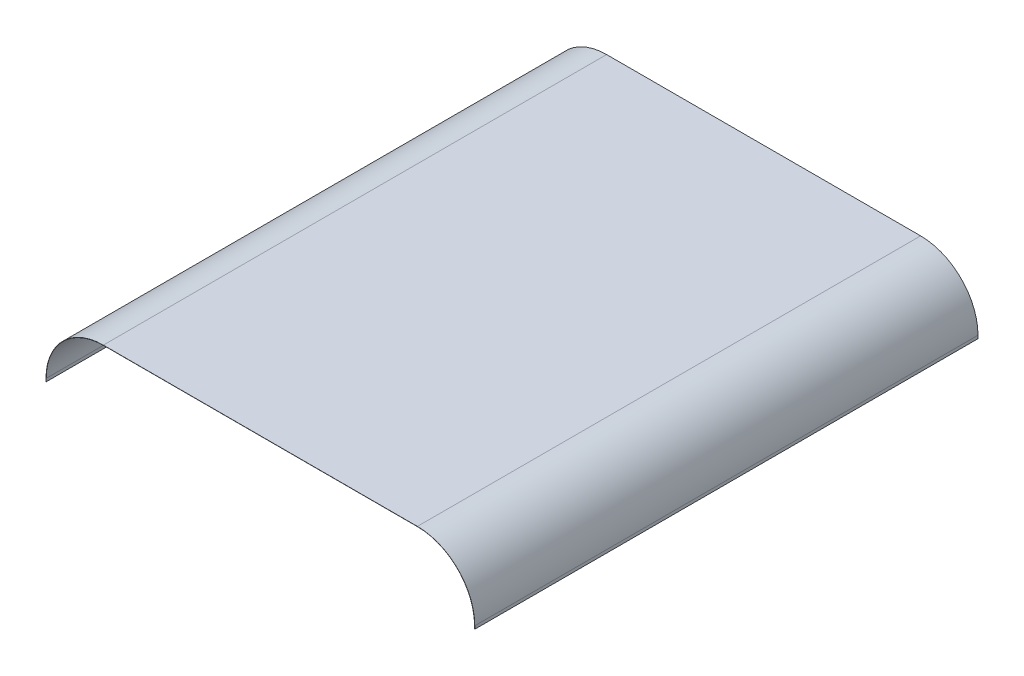
ISO-10303-21;
HEADER;
FILE_DESCRIPTION(('STEP AP214'),'2;1');
FILE_NAME('part.step','',(''),(''),'','','');
FILE_SCHEMA(('AUTOMOTIVE_DESIGN { 1 0 10303 214 1 1 1 1 }'));
ENDSEC;
DATA;
#1=APPLICATION_CONTEXT('core data for automotive mechanical design processes');
#2=APPLICATION_PROTOCOL_DEFINITION('international standard','automotive_design',2000,#1);
#3=PRODUCT_CONTEXT('',#1,'mechanical');
#4=PRODUCT('Part','Part','',(#3));
#5=PRODUCT_RELATED_PRODUCT_CATEGORY('part','',(#4));
#6=PRODUCT_DEFINITION_FORMATION('','',#4);
#7=PRODUCT_DEFINITION_CONTEXT('part definition',#1,'design');
#8=PRODUCT_DEFINITION('design','',#6,#7);
#9=PRODUCT_DEFINITION_SHAPE('','',#8);
#10=(LENGTH_UNIT() NAMED_UNIT(*) SI_UNIT(.MILLI.,.METRE.));
#11=(NAMED_UNIT(*) PLANE_ANGLE_UNIT() SI_UNIT($,.RADIAN.));
#12=(NAMED_UNIT(*) SI_UNIT($,.STERADIAN.) SOLID_ANGLE_UNIT());
#13=UNCERTAINTY_MEASURE_WITH_UNIT(LENGTH_MEASURE(1.E-05),#10,'distance_accuracy_value','');
#14=(GEOMETRIC_REPRESENTATION_CONTEXT(3) GLOBAL_UNCERTAINTY_ASSIGNED_CONTEXT((#13)) GLOBAL_UNIT_ASSIGNED_CONTEXT((#10,
#11,#12)) REPRESENTATION_CONTEXT('',''));
#15=CARTESIAN_POINT('',(0.,0.,0.));
#16=DIRECTION('',(0.,0.,1.));
#17=DIRECTION('',(1.,0.,0.));
#18=AXIS2_PLACEMENT_3D('',#15,#16,#17);
#19=CARTESIAN_POINT('',(2130.,0.,0.));
#20=DIRECTION('',(0.,0.,-1.));
#21=DIRECTION('',(0.,-1.,0.));
#22=AXIS2_PLACEMENT_3D('',#19,#20,#21);
#23=PLANE('',#22);
#24=DIRECTION('',(0.,1.,0.));
#25=VECTOR('',#24,1.);
#26=CARTESIAN_POINT('',(2129.,0.,0.));
#27=LINE('',#26,#25);
#28=CARTESIAN_POINT('',(2129.,0.,0.));
#29=VERTEX_POINT('',#28);
#30=CARTESIAN_POINT('',(2129.,-15.,0.));
#31=VERTEX_POINT('',#30);
#32=EDGE_CURVE('E196',#29,#31,#27,.F.);
#33=ORIENTED_EDGE('',*,*,#32,.F.);
#34=CARTESIAN_POINT('',(1845.,0.,0.));
#35=DIRECTION('',(0.,0.,1.));
#36=DIRECTION('',(1.,0.,0.));
#37=AXIS2_PLACEMENT_3D('',#34,#35,#36);
#38=CIRCLE('',#37,284.);
#39=CARTESIAN_POINT('',(1845.,284.,0.));
#40=VERTEX_POINT('',#39);
#41=EDGE_CURVE('E192',#40,#29,#38,.F.);
#42=ORIENTED_EDGE('',*,*,#41,.F.);
#43=DIRECTION('',(1.,0.,0.));
#44=VECTOR('',#43,1.);
#45=CARTESIAN_POINT('',(285.,284.,0.));
#46=LINE('',#45,#44);
#47=CARTESIAN_POINT('',(285.,284.,0.));
#48=VERTEX_POINT('',#47);
#49=EDGE_CURVE('E188',#48,#40,#46,.T.);
#50=ORIENTED_EDGE('',*,*,#49,.F.);
#51=CARTESIAN_POINT('',(285.,0.,0.));
#52=DIRECTION('',(0.,0.,1.));
#53=DIRECTION('',(1.,0.,0.));
#54=AXIS2_PLACEMENT_3D('',#51,#52,#53);
#55=CIRCLE('',#54,284.);
#56=CARTESIAN_POINT('',(1.,0.,0.));
#57=VERTEX_POINT('',#56);
#58=EDGE_CURVE('E185',#57,#48,#55,.F.);
#59=ORIENTED_EDGE('',*,*,#58,.F.);
#60=DIRECTION('',(0.,1.,0.));
#61=VECTOR('',#60,1.);
#62=CARTESIAN_POINT('',(1.,0.,0.));
#63=LINE('',#62,#61);
#64=CARTESIAN_POINT('',(1.,-15.,0.));
#65=VERTEX_POINT('',#64);
#66=EDGE_CURVE('E181',#65,#57,#63,.T.);
#67=ORIENTED_EDGE('',*,*,#66,.F.);
#68=DIRECTION('',(1.,0.,0.));
#69=VECTOR('',#68,1.);
#70=CARTESIAN_POINT('',(0.,-15.,0.));
#71=LINE('',#70,#69);
#72=CARTESIAN_POINT('',(0.,-15.,0.));
#73=VERTEX_POINT('',#72);
#74=EDGE_CURVE('E11',#73,#65,#71,.T.);
#75=ORIENTED_EDGE('',*,*,#74,.F.);
#76=DIRECTION('',(0.,1.,0.));
#77=VECTOR('',#76,1.);
#78=CARTESIAN_POINT('',(0.,0.,0.));
#79=LINE('',#78,#77);
#80=CARTESIAN_POINT('',(0.,0.,0.));
#81=VERTEX_POINT('',#80);
#82=EDGE_CURVE('E154',#73,#81,#79,.T.);
#83=ORIENTED_EDGE('',*,*,#82,.T.);
#84=CARTESIAN_POINT('',(285.,0.,0.));
#85=DIRECTION('',(0.,0.,-1.));
#86=DIRECTION('',(-1.,0.,0.));
#87=AXIS2_PLACEMENT_3D('',#84,#85,#86);
#88=CIRCLE('',#87,285.);
#89=CARTESIAN_POINT('',(285.,285.,0.));
#90=VERTEX_POINT('',#89);
#91=EDGE_CURVE('E156',#81,#90,#88,.T.);
#92=ORIENTED_EDGE('',*,*,#91,.T.);
#93=DIRECTION('',(1.,0.,0.));
#94=VECTOR('',#93,1.);
#95=CARTESIAN_POINT('',(285.,285.,0.));
#96=LINE('',#95,#94);
#97=CARTESIAN_POINT('',(1845.,285.,0.));
#98=VERTEX_POINT('',#97);
#99=EDGE_CURVE('E149',#90,#98,#96,.T.);
#100=ORIENTED_EDGE('',*,*,#99,.T.);
#101=CARTESIAN_POINT('',(1845.,0.,0.));
#102=DIRECTION('',(0.,0.,-1.));
#103=DIRECTION('',(1.,0.,0.));
#104=AXIS2_PLACEMENT_3D('',#101,#102,#103);
#105=CIRCLE('',#104,285.);
#106=CARTESIAN_POINT('',(2130.,0.,0.));
#107=VERTEX_POINT('',#106);
#108=EDGE_CURVE('E146',#98,#107,#105,.T.);
#109=ORIENTED_EDGE('',*,*,#108,.T.);
#110=DIRECTION('',(0.,-1.,0.));
#111=VECTOR('',#110,1.);
#112=CARTESIAN_POINT('',(2130.,0.,0.));
#113=LINE('',#112,#111);
#114=CARTESIAN_POINT('',(2130.,-15.,0.));
#115=VERTEX_POINT('',#114);
#116=EDGE_CURVE('E136',#107,#115,#113,.T.);
#117=ORIENTED_EDGE('',*,*,#116,.T.);
#118=DIRECTION('',(-1.,0.,0.));
#119=VECTOR('',#118,1.);
#120=CARTESIAN_POINT('',(2130.,-15.,0.));
#121=LINE('',#120,#119);
#122=EDGE_CURVE('E46',#115,#31,#121,.T.);
#123=ORIENTED_EDGE('',*,*,#122,.T.);
#124=EDGE_LOOP('',(#33,#42,#50,#59,#67,#75,#83,#92,#100,#109,#117,#123));
#125=FACE_BOUND('',#124,.T.);
#126=ADVANCED_FACE('F36',(#125),#23,.T.);
#127=CARTESIAN_POINT('',(2130.,-15.,0.));
#128=DIRECTION('',(0.,-1.,0.));
#129=DIRECTION('',(0.,0.,1.));
#130=AXIS2_PLACEMENT_3D('',#127,#128,#129);
#131=PLANE('',#130);
#132=ORIENTED_EDGE('',*,*,#122,.F.);
#133=DIRECTION('',(0.,0.,1.));
#134=VECTOR('',#133,1.);
#135=CARTESIAN_POINT('',(2130.,-15.,0.));
#136=LINE('',#135,#134);
#137=CARTESIAN_POINT('',(2130.,-15.,2500.));
#138=VERTEX_POINT('',#137);
#139=EDGE_CURVE('E132',#115,#138,#136,.T.);
#140=ORIENTED_EDGE('',*,*,#139,.T.);
#141=DIRECTION('',(-1.,0.,0.));
#142=VECTOR('',#141,1.);
#143=CARTESIAN_POINT('',(2130.,-15.,2500.));
#144=LINE('',#143,#142);
#145=CARTESIAN_POINT('',(2129.,-15.,2500.));
#146=VERTEX_POINT('',#145);
#147=EDGE_CURVE('E117',#138,#146,#144,.T.);
#148=ORIENTED_EDGE('',*,*,#147,.T.);
#149=DIRECTION('',(0.,0.,1.));
#150=VECTOR('',#149,1.);
#151=CARTESIAN_POINT('',(2129.,-15.,0.));
#152=LINE('',#151,#150);
#153=EDGE_CURVE('E198',#31,#146,#152,.T.);
#154=ORIENTED_EDGE('',*,*,#153,.F.);
#155=EDGE_LOOP('',(#132,#140,#148,#154));
#156=FACE_BOUND('',#155,.T.);
#157=ADVANCED_FACE('F134',(#156),#131,.T.);
#158=CARTESIAN_POINT('',(0.,0.,2500.));
#159=DIRECTION('',(0.,0.,-1.));
#160=DIRECTION('',(0.,1.,0.));
#161=AXIS2_PLACEMENT_3D('',#158,#159,#160);
#162=PLANE('',#161);
#163=DIRECTION('',(0.,1.,0.));
#164=VECTOR('',#163,1.);
#165=CARTESIAN_POINT('',(1.,0.,2500.));
#166=LINE('',#165,#164);
#167=CARTESIAN_POINT('',(1.,-15.,2500.));
#168=VERTEX_POINT('',#167);
#169=CARTESIAN_POINT('',(1.,0.,2500.));
#170=VERTEX_POINT('',#169);
#171=EDGE_CURVE('E182',#168,#170,#166,.T.);
#172=ORIENTED_EDGE('',*,*,#171,.T.);
#173=CARTESIAN_POINT('',(285.,0.,2500.));
#174=DIRECTION('',(0.,0.,1.));
#175=DIRECTION('',(1.,0.,0.));
#176=AXIS2_PLACEMENT_3D('',#173,#174,#175);
#177=CIRCLE('',#176,284.);
#178=CARTESIAN_POINT('',(285.,284.,2500.));
#179=VERTEX_POINT('',#178);
#180=EDGE_CURVE('E190',#170,#179,#177,.F.);
#181=ORIENTED_EDGE('',*,*,#180,.T.);
#182=DIRECTION('',(1.,0.,0.));
#183=VECTOR('',#182,1.);
#184=CARTESIAN_POINT('',(285.,284.,2500.));
#185=LINE('',#184,#183);
#186=CARTESIAN_POINT('',(1845.,284.,2500.));
#187=VERTEX_POINT('',#186);
#188=EDGE_CURVE('E194',#179,#187,#185,.T.);
#189=ORIENTED_EDGE('',*,*,#188,.T.);
#190=CARTESIAN_POINT('',(1845.,0.,2500.));
#191=DIRECTION('',(0.,0.,1.));
#192=DIRECTION('',(1.,0.,0.));
#193=AXIS2_PLACEMENT_3D('',#190,#191,#192);
#194=CIRCLE('',#193,284.);
#195=CARTESIAN_POINT('',(2129.,0.,2500.));
#196=VERTEX_POINT('',#195);
#197=EDGE_CURVE('E201',#187,#196,#194,.F.);
#198=ORIENTED_EDGE('',*,*,#197,.T.);
#199=DIRECTION('',(0.,1.,0.));
#200=VECTOR('',#199,1.);
#201=CARTESIAN_POINT('',(2129.,0.,2500.));
#202=LINE('',#201,#200);
#203=EDGE_CURVE('E124',#196,#146,#202,.F.);
#204=ORIENTED_EDGE('',*,*,#203,.T.);
#205=ORIENTED_EDGE('',*,*,#147,.F.);
#206=DIRECTION('',(0.,-1.,0.));
#207=VECTOR('',#206,1.);
#208=CARTESIAN_POINT('',(2130.,0.,2500.));
#209=LINE('',#208,#207);
#210=CARTESIAN_POINT('',(2130.,0.,2500.));
#211=VERTEX_POINT('',#210);
#212=EDGE_CURVE('E121',#211,#138,#209,.T.);
#213=ORIENTED_EDGE('',*,*,#212,.F.);
#214=CARTESIAN_POINT('',(1845.,0.,2500.));
#215=DIRECTION('',(0.,0.,-1.));
#216=DIRECTION('',(1.,0.,0.));
#217=AXIS2_PLACEMENT_3D('',#214,#215,#216);
#218=CIRCLE('',#217,285.);
#219=CARTESIAN_POINT('',(1845.,285.,2500.));
#220=VERTEX_POINT('',#219);
#221=EDGE_CURVE('E135',#220,#211,#218,.T.);
#222=ORIENTED_EDGE('',*,*,#221,.F.);
#223=DIRECTION('',(1.,0.,0.));
#224=VECTOR('',#223,1.);
#225=CARTESIAN_POINT('',(285.,285.,2500.));
#226=LINE('',#225,#224);
#227=CARTESIAN_POINT('',(285.,285.,2500.));
#228=VERTEX_POINT('',#227);
#229=EDGE_CURVE('E150',#228,#220,#226,.T.);
#230=ORIENTED_EDGE('',*,*,#229,.F.);
#231=CARTESIAN_POINT('',(285.,0.,2500.));
#232=DIRECTION('',(0.,0.,-1.));
#233=DIRECTION('',(-1.,0.,0.));
#234=AXIS2_PLACEMENT_3D('',#231,#232,#233);
#235=CIRCLE('',#234,285.);
#236=CARTESIAN_POINT('',(0.,0.,2500.));
#237=VERTEX_POINT('',#236);
#238=EDGE_CURVE('E157',#237,#228,#235,.T.);
#239=ORIENTED_EDGE('',*,*,#238,.F.);
#240=DIRECTION('',(0.,1.,0.));
#241=VECTOR('',#240,1.);
#242=CARTESIAN_POINT('',(0.,0.,2500.));
#243=LINE('',#242,#241);
#244=CARTESIAN_POINT('',(0.,-15.,2500.));
#245=VERTEX_POINT('',#244);
#246=EDGE_CURVE('E143',#245,#237,#243,.T.);
#247=ORIENTED_EDGE('',*,*,#246,.F.);
#248=DIRECTION('',(1.,0.,0.));
#249=VECTOR('',#248,1.);
#250=CARTESIAN_POINT('',(0.,-15.,2500.));
#251=LINE('',#250,#249);
#252=EDGE_CURVE('E40',#245,#168,#251,.T.);
#253=ORIENTED_EDGE('',*,*,#252,.T.);
#254=EDGE_LOOP('',(#172,#181,#189,#198,#204,#205,#213,#222,#230,#239,#247,#253));
#255=FACE_BOUND('',#254,.T.);
#256=ADVANCED_FACE('F119',(#255),#162,.F.);
#257=CARTESIAN_POINT('',(0.,-15.,0.));
#258=DIRECTION('',(0.,1.,0.));
#259=DIRECTION('',(0.,0.,1.));
#260=AXIS2_PLACEMENT_3D('',#257,#258,#259);
#261=PLANE('',#260);
#262=DIRECTION('',(0.,0.,1.));
#263=VECTOR('',#262,1.);
#264=CARTESIAN_POINT('',(0.,-15.,0.));
#265=LINE('',#264,#263);
#266=EDGE_CURVE('E151',#73,#245,#265,.T.);
#267=ORIENTED_EDGE('',*,*,#266,.F.);
#268=ORIENTED_EDGE('',*,*,#74,.T.);
#269=DIRECTION('',(0.,0.,1.));
#270=VECTOR('',#269,1.);
#271=CARTESIAN_POINT('',(1.,-15.,0.));
#272=LINE('',#271,#270);
#273=EDGE_CURVE('E178',#65,#168,#272,.T.);
#274=ORIENTED_EDGE('',*,*,#273,.T.);
#275=ORIENTED_EDGE('',*,*,#252,.F.);
#276=EDGE_LOOP('',(#267,#268,#274,#275));
#277=FACE_BOUND('',#276,.T.);
#278=ADVANCED_FACE('F38',(#277),#261,.F.);
#279=CARTESIAN_POINT('',(1.,0.,0.));
#280=DIRECTION('',(1.,0.,0.));
#281=DIRECTION('',(0.,1.,0.));
#282=AXIS2_PLACEMENT_3D('',#279,#280,#281);
#283=PLANE('',#282);
#284=ORIENTED_EDGE('',*,*,#171,.F.);
#285=ORIENTED_EDGE('',*,*,#273,.F.);
#286=ORIENTED_EDGE('',*,*,#66,.T.);
#287=DIRECTION('',(0.,0.,1.));
#288=VECTOR('',#287,1.);
#289=CARTESIAN_POINT('',(1.,0.,0.));
#290=LINE('',#289,#288);
#291=EDGE_CURVE('E187',#57,#170,#290,.T.);
#292=ORIENTED_EDGE('',*,*,#291,.T.);
#293=EDGE_LOOP('',(#284,#285,#286,#292));
#294=FACE_BOUND('',#293,.T.);
#295=ADVANCED_FACE('F219',(#294),#283,.T.);
#296=CARTESIAN_POINT('',(285.,0.,0.));
#297=DIRECTION('',(0.,0.,1.));
#298=DIRECTION('',(1.,0.,0.));
#299=AXIS2_PLACEMENT_3D('',#296,#297,#298);
#300=CYLINDRICAL_SURFACE('',#299,284.);
#301=ORIENTED_EDGE('',*,*,#180,.F.);
#302=ORIENTED_EDGE('',*,*,#291,.F.);
#303=ORIENTED_EDGE('',*,*,#58,.T.);
#304=DIRECTION('',(0.,0.,1.));
#305=VECTOR('',#304,1.);
#306=CARTESIAN_POINT('',(285.,284.,0.));
#307=LINE('',#306,#305);
#308=EDGE_CURVE('E191',#48,#179,#307,.T.);
#309=ORIENTED_EDGE('',*,*,#308,.T.);
#310=EDGE_LOOP('',(#301,#302,#303,#309));
#311=FACE_BOUND('',#310,.T.);
#312=ADVANCED_FACE('F225',(#311),#300,.F.);
#313=CARTESIAN_POINT('',(285.,284.,0.));
#314=DIRECTION('',(0.,-1.,0.));
#315=DIRECTION('',(0.,0.,-1.));
#316=AXIS2_PLACEMENT_3D('',#313,#314,#315);
#317=PLANE('',#316);
#318=ORIENTED_EDGE('',*,*,#188,.F.);
#319=ORIENTED_EDGE('',*,*,#308,.F.);
#320=ORIENTED_EDGE('',*,*,#49,.T.);
#321=DIRECTION('',(0.,0.,-1.));
#322=VECTOR('',#321,1.);
#323=CARTESIAN_POINT('',(1845.,284.,0.));
#324=LINE('',#323,#322);
#325=EDGE_CURVE('E195',#40,#187,#324,.F.);
#326=ORIENTED_EDGE('',*,*,#325,.T.);
#327=EDGE_LOOP('',(#318,#319,#320,#326));
#328=FACE_BOUND('',#327,.T.);
#329=ADVANCED_FACE('F239',(#328),#317,.T.);
#330=CARTESIAN_POINT('',(1845.,0.,0.));
#331=DIRECTION('',(0.,0.,1.));
#332=DIRECTION('',(1.,0.,0.));
#333=AXIS2_PLACEMENT_3D('',#330,#331,#332);
#334=CYLINDRICAL_SURFACE('',#333,284.);
#335=ORIENTED_EDGE('',*,*,#197,.F.);
#336=ORIENTED_EDGE('',*,*,#325,.F.);
#337=ORIENTED_EDGE('',*,*,#41,.T.);
#338=DIRECTION('',(0.,0.,1.));
#339=VECTOR('',#338,1.);
#340=CARTESIAN_POINT('',(2129.,0.,0.));
#341=LINE('',#340,#339);
#342=EDGE_CURVE('E199',#29,#196,#341,.T.);
#343=ORIENTED_EDGE('',*,*,#342,.T.);
#344=EDGE_LOOP('',(#335,#336,#337,#343));
#345=FACE_BOUND('',#344,.T.);
#346=ADVANCED_FACE('F249',(#345),#334,.F.);
#347=CARTESIAN_POINT('',(2129.,0.,0.));
#348=DIRECTION('',(-1.,0.,0.));
#349=DIRECTION('',(0.,0.,1.));
#350=AXIS2_PLACEMENT_3D('',#347,#348,#349);
#351=PLANE('',#350);
#352=ORIENTED_EDGE('',*,*,#203,.F.);
#353=ORIENTED_EDGE('',*,*,#342,.F.);
#354=ORIENTED_EDGE('',*,*,#32,.T.);
#355=ORIENTED_EDGE('',*,*,#153,.T.);
#356=EDGE_LOOP('',(#352,#353,#354,#355));
#357=FACE_BOUND('',#356,.T.);
#358=ADVANCED_FACE('F248',(#357),#351,.T.);
#359=CARTESIAN_POINT('',(0.,0.,0.));
#360=DIRECTION('',(1.,0.,0.));
#361=DIRECTION('',(0.,1.,0.));
#362=AXIS2_PLACEMENT_3D('',#359,#360,#361);
#363=PLANE('',#362);
#364=ORIENTED_EDGE('',*,*,#246,.T.);
#365=DIRECTION('',(0.,0.,1.));
#366=VECTOR('',#365,1.);
#367=CARTESIAN_POINT('',(0.,0.,0.));
#368=LINE('',#367,#366);
#369=EDGE_CURVE('E155',#81,#237,#368,.T.);
#370=ORIENTED_EDGE('',*,*,#369,.F.);
#371=ORIENTED_EDGE('',*,*,#82,.F.);
#372=ORIENTED_EDGE('',*,*,#266,.T.);
#373=EDGE_LOOP('',(#364,#370,#371,#372));
#374=FACE_BOUND('',#373,.T.);
#375=ADVANCED_FACE('F233',(#374),#363,.F.);
#376=CARTESIAN_POINT('',(285.,0.,0.));
#377=DIRECTION('',(0.,0.,1.));
#378=DIRECTION('',(1.,0.,0.));
#379=AXIS2_PLACEMENT_3D('',#376,#377,#378);
#380=CYLINDRICAL_SURFACE('',#379,285.);
#381=ORIENTED_EDGE('',*,*,#238,.T.);
#382=DIRECTION('',(0.,0.,1.));
#383=VECTOR('',#382,1.);
#384=CARTESIAN_POINT('',(285.,285.,0.));
#385=LINE('',#384,#383);
#386=EDGE_CURVE('E147',#90,#228,#385,.T.);
#387=ORIENTED_EDGE('',*,*,#386,.F.);
#388=ORIENTED_EDGE('',*,*,#91,.F.);
#389=ORIENTED_EDGE('',*,*,#369,.T.);
#390=EDGE_LOOP('',(#381,#387,#388,#389));
#391=FACE_BOUND('',#390,.T.);
#392=ADVANCED_FACE('F268',(#391),#380,.T.);
#393=CARTESIAN_POINT('',(285.,285.,0.));
#394=DIRECTION('',(0.,-1.,0.));
#395=DIRECTION('',(0.,0.,-1.));
#396=AXIS2_PLACEMENT_3D('',#393,#394,#395);
#397=PLANE('',#396);
#398=ORIENTED_EDGE('',*,*,#229,.T.);
#399=DIRECTION('',(0.,0.,1.));
#400=VECTOR('',#399,1.);
#401=CARTESIAN_POINT('',(1845.,285.,0.));
#402=LINE('',#401,#400);
#403=EDGE_CURVE('E138',#98,#220,#402,.T.);
#404=ORIENTED_EDGE('',*,*,#403,.F.);
#405=ORIENTED_EDGE('',*,*,#99,.F.);
#406=ORIENTED_EDGE('',*,*,#386,.T.);
#407=EDGE_LOOP('',(#398,#404,#405,#406));
#408=FACE_BOUND('',#407,.T.);
#409=ADVANCED_FACE('F271',(#408),#397,.F.);
#410=CARTESIAN_POINT('',(1845.,0.,0.));
#411=DIRECTION('',(0.,0.,1.));
#412=DIRECTION('',(1.,0.,0.));
#413=AXIS2_PLACEMENT_3D('',#410,#411,#412);
#414=CYLINDRICAL_SURFACE('',#413,285.);
#415=ORIENTED_EDGE('',*,*,#221,.T.);
#416=DIRECTION('',(0.,0.,1.));
#417=VECTOR('',#416,1.);
#418=CARTESIAN_POINT('',(2130.,0.,0.));
#419=LINE('',#418,#417);
#420=EDGE_CURVE('E110',#107,#211,#419,.T.);
#421=ORIENTED_EDGE('',*,*,#420,.F.);
#422=ORIENTED_EDGE('',*,*,#108,.F.);
#423=ORIENTED_EDGE('',*,*,#403,.T.);
#424=EDGE_LOOP('',(#415,#421,#422,#423));
#425=FACE_BOUND('',#424,.T.);
#426=ADVANCED_FACE('F274',(#425),#414,.T.);
#427=CARTESIAN_POINT('',(2130.,0.,0.));
#428=DIRECTION('',(-1.,0.,0.));
#429=DIRECTION('',(0.,0.,1.));
#430=AXIS2_PLACEMENT_3D('',#427,#428,#429);
#431=PLANE('',#430);
#432=ORIENTED_EDGE('',*,*,#212,.T.);
#433=ORIENTED_EDGE('',*,*,#139,.F.);
#434=ORIENTED_EDGE('',*,*,#116,.F.);
#435=ORIENTED_EDGE('',*,*,#420,.T.);
#436=EDGE_LOOP('',(#432,#433,#434,#435));
#437=FACE_BOUND('',#436,.T.);
#438=ADVANCED_FACE('F131',(#437),#431,.F.);
#439=CLOSED_SHELL('',(#126,#157,#256,#278,#295,#312,#329,#346,#358,#375,#392,#409,#426,#438));
#440=MANIFOLD_SOLID_BREP('B2',#439);
#441=ADVANCED_BREP_SHAPE_REPRESENTATION('',(#18,#440),#14);
#442=SHAPE_DEFINITION_REPRESENTATION(#9,#441);
ENDSEC;
END-ISO-10303-21;
